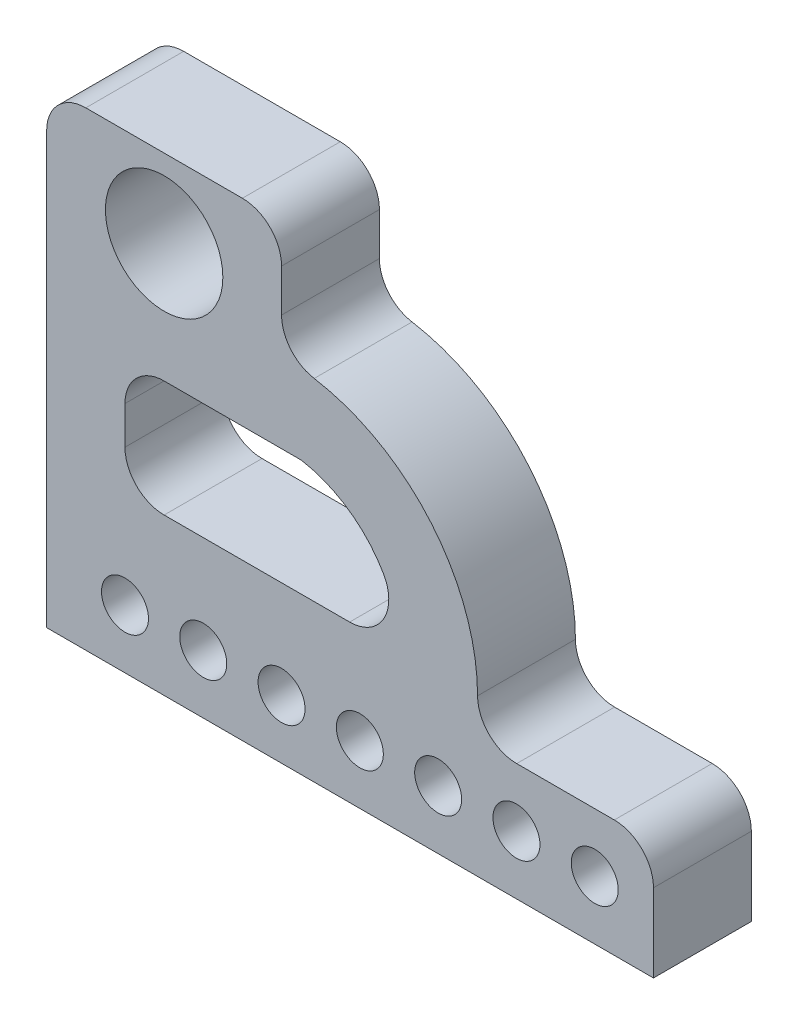
ISO-10303-21;
HEADER;
FILE_DESCRIPTION(('STEP AP214'),'2;1');
FILE_NAME('part.step','',(''),(''),'','','');
FILE_SCHEMA(('AUTOMOTIVE_DESIGN { 1 0 10303 214 1 1 1 1 }'));
ENDSEC;
DATA;
#1=APPLICATION_CONTEXT('core data for automotive mechanical design processes');
#2=APPLICATION_PROTOCOL_DEFINITION('international standard','automotive_design',2000,#1);
#3=PRODUCT_CONTEXT('',#1,'mechanical');
#4=PRODUCT('Part','Part','',(#3));
#5=PRODUCT_RELATED_PRODUCT_CATEGORY('part','',(#4));
#6=PRODUCT_DEFINITION_FORMATION('','',#4);
#7=PRODUCT_DEFINITION_CONTEXT('part definition',#1,'design');
#8=PRODUCT_DEFINITION('design','',#6,#7);
#9=PRODUCT_DEFINITION_SHAPE('','',#8);
#10=(LENGTH_UNIT() NAMED_UNIT(*) SI_UNIT(.MILLI.,.METRE.));
#11=(NAMED_UNIT(*) PLANE_ANGLE_UNIT() SI_UNIT($,.RADIAN.));
#12=(NAMED_UNIT(*) SI_UNIT($,.STERADIAN.) SOLID_ANGLE_UNIT());
#13=UNCERTAINTY_MEASURE_WITH_UNIT(LENGTH_MEASURE(1.E-05),#10,'distance_accuracy_value','');
#14=(GEOMETRIC_REPRESENTATION_CONTEXT(3) GLOBAL_UNCERTAINTY_ASSIGNED_CONTEXT((#13)) GLOBAL_UNIT_ASSIGNED_CONTEXT((#10,
#11,#12)) REPRESENTATION_CONTEXT('',''));
#15=CARTESIAN_POINT('',(0.,0.,0.));
#16=DIRECTION('',(0.,0.,1.));
#17=DIRECTION('',(1.,0.,0.));
#18=AXIS2_PLACEMENT_3D('',#15,#16,#17);
#19=CARTESIAN_POINT('',(64.9972203624435,-39.9551947285819,25.));
#20=DIRECTION('',(0.,0.,-1.));
#21=DIRECTION('',(-1.,0.,0.));
#22=AXIS2_PLACEMENT_3D('',#19,#20,#21);
#23=PLANE('',#22);
#24=CARTESIAN_POINT('',(-50.,40.0822492706513,25.));
#25=DIRECTION('',(0.,0.,1.));
#26=DIRECTION('',(1.,0.,0.));
#27=AXIS2_PLACEMENT_3D('',#24,#25,#26);
#28=CIRCLE('',#27,15.);
#29=CARTESIAN_POINT('',(-35.,40.0822492706513,25.));
#30=VERTEX_POINT('',#29);
#31=EDGE_CURVE('E225',#30,#30,#28,.T.);
#32=ORIENTED_EDGE('',*,*,#31,.F.);
#33=EDGE_LOOP('',(#32));
#34=FACE_BOUND('',#33,.T.);
#35=DIRECTION('',(1.,0.,0.));
#36=VECTOR('',#35,1.);
#37=CARTESIAN_POINT('',(-80.0027796375565,-59.9177507293487,25.));
#38=LINE('',#37,#36);
#39=CARTESIAN_POINT('',(-80.0027796375565,-59.9177507293487,25.));
#40=VERTEX_POINT('',#39);
#41=CARTESIAN_POINT('',(74.9972203624435,-59.9177507293487,25.));
#42=VERTEX_POINT('',#41);
#43=EDGE_CURVE('E231',#40,#42,#38,.T.);
#44=ORIENTED_EDGE('',*,*,#43,.T.);
#45=DIRECTION('',(0.,1.,0.));
#46=VECTOR('',#45,1.);
#47=CARTESIAN_POINT('',(74.9972203624435,-59.9177507293487,25.));
#48=LINE('',#47,#46);
#49=CARTESIAN_POINT('',(74.9972203624435,-39.9551947285819,25.));
#50=VERTEX_POINT('',#49);
#51=EDGE_CURVE('E234',#42,#50,#48,.T.);
#52=ORIENTED_EDGE('',*,*,#51,.T.);
#53=CARTESIAN_POINT('',(64.9972203624435,-39.9551947285819,25.));
#54=DIRECTION('',(0.,0.,1.));
#55=DIRECTION('',(-1.,0.,0.));
#56=AXIS2_PLACEMENT_3D('',#53,#54,#55);
#57=CIRCLE('',#56,10.);
#58=CARTESIAN_POINT('',(64.9995342558982,-29.9551949962871,25.));
#59=VERTEX_POINT('',#58);
#60=EDGE_CURVE('E237',#50,#59,#57,.T.);
#61=ORIENTED_EDGE('',*,*,#60,.T.);
#62=DIRECTION('',(-0.999999973229485,0.000231389345471848,0.));
#63=VECTOR('',#62,1.);
#64=CARTESIAN_POINT('',(40.0634272067355,-29.9494250466439,25.));
#65=LINE('',#64,#63);
#66=CARTESIAN_POINT('',(40.0634272067355,-29.9494250466439,25.));
#67=VERTEX_POINT('',#66);
#68=EDGE_CURVE('E239',#59,#67,#65,.T.);
#69=ORIENTED_EDGE('',*,*,#68,.T.);
#70=CARTESIAN_POINT('',(40.0657411001902,-19.949425314349,25.));
#71=DIRECTION('',(0.,0.,-1.));
#72=DIRECTION('',(1.,0.,0.));
#73=AXIS2_PLACEMENT_3D('',#70,#71,#72);
#74=CIRCLE('',#73,10.);
#75=CARTESIAN_POINT('',(30.0657444824087,-19.9576499333743,25.));
#76=VERTEX_POINT('',#75);
#77=EDGE_CURVE('E241',#67,#76,#74,.T.);
#78=ORIENTED_EDGE('',*,*,#77,.T.);
#79=CARTESIAN_POINT('',(-20.0164878493317,-19.9988406753921,25.));
#80=DIRECTION('',(0.,0.,1.));
#81=DIRECTION('',(1.,0.,0.));
#82=AXIS2_PLACEMENT_3D('',#79,#80,#81);
#83=CIRCLE('',#82,50.0822492706513);
#84=CARTESIAN_POINT('',(-11.6694463042231,29.3829230583172,25.));
#85=VERTEX_POINT('',#84);
#86=EDGE_CURVE('E243',#76,#85,#83,.T.);
#87=ORIENTED_EDGE('',*,*,#86,.T.);
#88=CARTESIAN_POINT('',(-10.0027796375565,39.2430560301499,25.));
#89=DIRECTION('',(0.,0.,-1.));
#90=DIRECTION('',(-1.,0.,0.));
#91=AXIS2_PLACEMENT_3D('',#88,#89,#90);
#92=CIRCLE('',#91,10.);
#93=CARTESIAN_POINT('',(-20.0027796375565,39.2430560301499,25.));
#94=VERTEX_POINT('',#93);
#95=EDGE_CURVE('E245',#85,#94,#92,.T.);
#96=ORIENTED_EDGE('',*,*,#95,.T.);
#97=DIRECTION('',(0.,1.,0.));
#98=VECTOR('',#97,1.);
#99=CARTESIAN_POINT('',(-20.0027796375565,50.0822492706512,25.));
#100=LINE('',#99,#98);
#101=CARTESIAN_POINT('',(-20.0027796375565,50.0822492706512,25.));
#102=VERTEX_POINT('',#101);
#103=EDGE_CURVE('E247',#94,#102,#100,.T.);
#104=ORIENTED_EDGE('',*,*,#103,.T.);
#105=CARTESIAN_POINT('',(-30.0027796375565,50.0822492706512,25.));
#106=DIRECTION('',(0.,0.,1.));
#107=DIRECTION('',(-1.,0.,0.));
#108=AXIS2_PLACEMENT_3D('',#105,#106,#107);
#109=CIRCLE('',#108,10.);
#110=CARTESIAN_POINT('',(-30.0027796375566,60.0822492706512,25.));
#111=VERTEX_POINT('',#110);
#112=EDGE_CURVE('E249',#102,#111,#109,.T.);
#113=ORIENTED_EDGE('',*,*,#112,.T.);
#114=DIRECTION('',(-1.,0.,0.));
#115=VECTOR('',#114,1.);
#116=CARTESIAN_POINT('',(-70.0027796375564,60.0822492706512,25.));
#117=LINE('',#116,#115);
#118=CARTESIAN_POINT('',(-70.0027796375564,60.0822492706512,25.));
#119=VERTEX_POINT('',#118);
#120=EDGE_CURVE('E251',#111,#119,#117,.T.);
#121=ORIENTED_EDGE('',*,*,#120,.T.);
#122=CARTESIAN_POINT('',(-70.0027796375565,50.0822492706512,25.));
#123=DIRECTION('',(0.,0.,1.));
#124=DIRECTION('',(-1.,0.,0.));
#125=AXIS2_PLACEMENT_3D('',#122,#123,#124);
#126=CIRCLE('',#125,10.);
#127=CARTESIAN_POINT('',(-80.0027796375565,50.0822492706512,25.));
#128=VERTEX_POINT('',#127);
#129=EDGE_CURVE('E253',#119,#128,#126,.T.);
#130=ORIENTED_EDGE('',*,*,#129,.T.);
#131=DIRECTION('',(0.,-1.,0.));
#132=VECTOR('',#131,1.);
#133=CARTESIAN_POINT('',(-80.0027796375565,-59.9177507293487,25.));
#134=LINE('',#133,#132);
#135=EDGE_CURVE('E255',#128,#40,#134,.T.);
#136=ORIENTED_EDGE('',*,*,#135,.T.);
#137=EDGE_LOOP('',(#44,#52,#61,#69,#78,#87,#96,#104,#113,#121,#130,#136));
#138=FACE_BOUND('',#137,.T.);
#139=CARTESIAN_POINT('',(-2.61260262640391,-9.97878504102906,25.));
#140=DIRECTION('',(0.,0.,1.));
#141=DIRECTION('',(-1.,0.,0.));
#142=AXIS2_PLACEMENT_3D('',#139,#140,#141);
#143=CIRCLE('',#142,10.);
#144=CARTESIAN_POINT('',(-2.60890612720822,-19.9787843578237,25.));
#145=VERTEX_POINT('',#144);
#146=CARTESIAN_POINT('',(6.05370013100796,-4.98927639619485,25.));
#147=VERTEX_POINT('',#146);
#148=EDGE_CURVE('E164',#145,#147,#143,.T.);
#149=ORIENTED_EDGE('',*,*,#148,.F.);
#150=DIRECTION('',(0.999999931679466,0.000369649919568534,0.));
#151=VECTOR('',#150,1.);
#152=CARTESIAN_POINT('',(-49.9990831383608,-19.9963021341411,25.));
#153=LINE('',#152,#151);
#154=CARTESIAN_POINT('',(-49.9990831383608,-19.9963021341411,25.));
#155=VERTEX_POINT('',#154);
#156=EDGE_CURVE('E197',#155,#145,#153,.T.);
#157=ORIENTED_EDGE('',*,*,#156,.F.);
#158=CARTESIAN_POINT('',(-50.0027796375565,-9.9963028173464,25.));
#159=DIRECTION('',(0.,0.,1.));
#160=DIRECTION('',(1.,0.,0.));
#161=AXIS2_PLACEMENT_3D('',#158,#159,#160);
#162=CIRCLE('',#161,10.);
#163=CARTESIAN_POINT('',(-60.0027796375565,-9.99630281734633,25.));
#164=VERTEX_POINT('',#163);
#165=EDGE_CURVE('E195',#164,#155,#162,.T.);
#166=ORIENTED_EDGE('',*,*,#165,.F.);
#167=DIRECTION('',(0.,-1.,0.));
#168=VECTOR('',#167,1.);
#169=CARTESIAN_POINT('',(-60.0027796375565,-0.337342885348287,25.));
#170=LINE('',#169,#168);
#171=CARTESIAN_POINT('',(-60.0027796375565,-0.337342885348287,25.));
#172=VERTEX_POINT('',#171);
#173=EDGE_CURVE('E193',#172,#164,#170,.T.);
#174=ORIENTED_EDGE('',*,*,#173,.F.);
#175=CARTESIAN_POINT('',(-50.0027796375565,-0.337342885348216,25.));
#176=DIRECTION('',(0.,0.,1.));
#177=DIRECTION('',(-1.,0.,0.));
#178=AXIS2_PLACEMENT_3D('',#175,#176,#177);
#179=CIRCLE('',#178,10.);
#180=CARTESIAN_POINT('',(-50.0027796375564,9.66265711465178,25.));
#181=VERTEX_POINT('',#180);
#182=EDGE_CURVE('E188',#181,#172,#179,.T.);
#183=ORIENTED_EDGE('',*,*,#182,.F.);
#184=DIRECTION('',(-1.,0.,0.));
#185=VECTOR('',#184,1.);
#186=CARTESIAN_POINT('',(-15.0027796375565,9.66265711465179,25.));
#187=LINE('',#186,#185);
#188=CARTESIAN_POINT('',(-15.0027796375565,9.66265711465179,25.));
#189=VERTEX_POINT('',#188);
#190=EDGE_CURVE('E186',#189,#181,#187,.T.);
#191=ORIENTED_EDGE('',*,*,#190,.F.);
#192=CARTESIAN_POINT('',(-20.0164878493317,-19.9988406753921,25.));
#193=DIRECTION('',(0.,0.,1.));
#194=DIRECTION('',(1.,0.,0.));
#195=AXIS2_PLACEMENT_3D('',#192,#193,#194);
#196=CIRCLE('',#195,30.0822492706513);
#197=EDGE_CURVE('E172',#147,#189,#196,.T.);
#198=ORIENTED_EDGE('',*,*,#197,.F.);
#199=EDGE_LOOP('',(#149,#157,#166,#174,#183,#191,#198));
#200=FACE_BOUND('',#199,.T.);
#201=CARTESIAN_POINT('',(-40.0027796375565,-44.9177507293487,25.));
#202=DIRECTION('',(0.,0.,1.));
#203=DIRECTION('',(1.,0.,0.));
#204=AXIS2_PLACEMENT_3D('',#201,#202,#203);
#205=CIRCLE('',#204,6.);
#206=CARTESIAN_POINT('',(-34.0027796375565,-44.9177507293487,25.));
#207=VERTEX_POINT('',#206);
#208=EDGE_CURVE('E200',#207,#207,#205,.T.);
#209=ORIENTED_EDGE('',*,*,#208,.F.);
#210=EDGE_LOOP('',(#209));
#211=FACE_BOUND('',#210,.T.);
#212=CARTESIAN_POINT('',(-60.0027796375565,-44.9177507293487,25.));
#213=DIRECTION('',(0.,0.,1.));
#214=DIRECTION('',(1.,0.,0.));
#215=AXIS2_PLACEMENT_3D('',#212,#213,#214);
#216=CIRCLE('',#215,6.);
#217=CARTESIAN_POINT('',(-54.0027796375565,-44.9177507293487,25.));
#218=VERTEX_POINT('',#217);
#219=EDGE_CURVE('E665',#218,#218,#216,.T.);
#220=ORIENTED_EDGE('',*,*,#219,.F.);
#221=EDGE_LOOP('',(#220));
#222=FACE_BOUND('',#221,.T.);
#223=CARTESIAN_POINT('',(-20.0027796375565,-44.9177507293487,25.));
#224=DIRECTION('',(0.,0.,1.));
#225=DIRECTION('',(1.,0.,0.));
#226=AXIS2_PLACEMENT_3D('',#223,#224,#225);
#227=CIRCLE('',#226,6.);
#228=CARTESIAN_POINT('',(-14.0027796375565,-44.9177507293487,25.));
#229=VERTEX_POINT('',#228);
#230=EDGE_CURVE('E659',#229,#229,#227,.T.);
#231=ORIENTED_EDGE('',*,*,#230,.F.);
#232=EDGE_LOOP('',(#231));
#233=FACE_BOUND('',#232,.T.);
#234=CARTESIAN_POINT('',(-0.00277963755651589,-44.9177507293487,25.));
#235=DIRECTION('',(0.,0.,1.));
#236=DIRECTION('',(1.,0.,0.));
#237=AXIS2_PLACEMENT_3D('',#234,#235,#236);
#238=CIRCLE('',#237,6.);
#239=CARTESIAN_POINT('',(5.99722036244349,-44.9177507293487,25.));
#240=VERTEX_POINT('',#239);
#241=EDGE_CURVE('E653',#240,#240,#238,.T.);
#242=ORIENTED_EDGE('',*,*,#241,.F.);
#243=EDGE_LOOP('',(#242));
#244=FACE_BOUND('',#243,.T.);
#245=CARTESIAN_POINT('',(19.9972203624435,-44.9177507293487,25.));
#246=DIRECTION('',(0.,0.,1.));
#247=DIRECTION('',(1.,0.,0.));
#248=AXIS2_PLACEMENT_3D('',#245,#246,#247);
#249=CIRCLE('',#248,6.);
#250=CARTESIAN_POINT('',(25.9972203624435,-44.9177507293487,25.));
#251=VERTEX_POINT('',#250);
#252=EDGE_CURVE('E647',#251,#251,#249,.T.);
#253=ORIENTED_EDGE('',*,*,#252,.F.);
#254=EDGE_LOOP('',(#253));
#255=FACE_BOUND('',#254,.T.);
#256=CARTESIAN_POINT('',(39.9972203624435,-44.9177507293487,25.));
#257=DIRECTION('',(0.,0.,1.));
#258=DIRECTION('',(1.,0.,0.));
#259=AXIS2_PLACEMENT_3D('',#256,#257,#258);
#260=CIRCLE('',#259,6.);
#261=CARTESIAN_POINT('',(45.9972203624435,-44.9177507293487,25.));
#262=VERTEX_POINT('',#261);
#263=EDGE_CURVE('E641',#262,#262,#260,.T.);
#264=ORIENTED_EDGE('',*,*,#263,.F.);
#265=EDGE_LOOP('',(#264));
#266=FACE_BOUND('',#265,.T.);
#267=CARTESIAN_POINT('',(59.9972203624435,-44.9177507293487,25.));
#268=DIRECTION('',(0.,0.,1.));
#269=DIRECTION('',(1.,0.,0.));
#270=AXIS2_PLACEMENT_3D('',#267,#268,#269);
#271=CIRCLE('',#270,6.);
#272=CARTESIAN_POINT('',(65.9972203624435,-44.9177507293487,25.));
#273=VERTEX_POINT('',#272);
#274=EDGE_CURVE('E632',#273,#273,#271,.T.);
#275=ORIENTED_EDGE('',*,*,#274,.F.);
#276=EDGE_LOOP('',(#275));
#277=FACE_BOUND('',#276,.T.);
#278=ADVANCED_FACE('F33',(#34,#138,#200,#211,#222,#233,#244,#255,#266,#277),#23,.F.);
#279=CARTESIAN_POINT('',(64.9972203624435,-39.9551947285819,0.));
#280=DIRECTION('',(0.,0.,-1.));
#281=DIRECTION('',(-1.,0.,0.));
#282=AXIS2_PLACEMENT_3D('',#279,#280,#281);
#283=PLANE('',#282);
#284=CARTESIAN_POINT('',(39.9972203624435,-44.9177507293487,0.));
#285=DIRECTION('',(0.,0.,1.));
#286=DIRECTION('',(1.,0.,0.));
#287=AXIS2_PLACEMENT_3D('',#284,#285,#286);
#288=CIRCLE('',#287,6.);
#289=CARTESIAN_POINT('',(45.9972203624435,-44.9177507293487,0.));
#290=VERTEX_POINT('',#289);
#291=EDGE_CURVE('E638',#290,#290,#288,.T.);
#292=ORIENTED_EDGE('',*,*,#291,.T.);
#293=EDGE_LOOP('',(#292));
#294=FACE_BOUND('',#293,.T.);
#295=CARTESIAN_POINT('',(-0.00277963755651589,-44.9177507293487,0.));
#296=DIRECTION('',(0.,0.,1.));
#297=DIRECTION('',(1.,0.,0.));
#298=AXIS2_PLACEMENT_3D('',#295,#296,#297);
#299=CIRCLE('',#298,6.);
#300=CARTESIAN_POINT('',(5.99722036244349,-44.9177507293487,0.));
#301=VERTEX_POINT('',#300);
#302=EDGE_CURVE('E650',#301,#301,#299,.T.);
#303=ORIENTED_EDGE('',*,*,#302,.T.);
#304=EDGE_LOOP('',(#303));
#305=FACE_BOUND('',#304,.T.);
#306=CARTESIAN_POINT('',(-60.0027796375565,-44.9177507293487,0.));
#307=DIRECTION('',(0.,0.,1.));
#308=DIRECTION('',(1.,0.,0.));
#309=AXIS2_PLACEMENT_3D('',#306,#307,#308);
#310=CIRCLE('',#309,6.);
#311=CARTESIAN_POINT('',(-54.0027796375565,-44.9177507293487,0.));
#312=VERTEX_POINT('',#311);
#313=EDGE_CURVE('E662',#312,#312,#310,.T.);
#314=ORIENTED_EDGE('',*,*,#313,.T.);
#315=EDGE_LOOP('',(#314));
#316=FACE_BOUND('',#315,.T.);
#317=DIRECTION('',(0.999999931679466,0.000369649919568534,0.));
#318=VECTOR('',#317,1.);
#319=CARTESIAN_POINT('',(-49.9990831383608,-19.9963021341411,0.));
#320=LINE('',#319,#318);
#321=CARTESIAN_POINT('',(-49.9990831383608,-19.9963021341411,0.));
#322=VERTEX_POINT('',#321);
#323=CARTESIAN_POINT('',(-2.60890612720822,-19.9787843578237,0.));
#324=VERTEX_POINT('',#323);
#325=EDGE_CURVE('E173',#322,#324,#320,.T.);
#326=ORIENTED_EDGE('',*,*,#325,.T.);
#327=CARTESIAN_POINT('',(-2.61260262640391,-9.97878504102906,0.));
#328=DIRECTION('',(0.,0.,1.));
#329=DIRECTION('',(-1.,0.,0.));
#330=AXIS2_PLACEMENT_3D('',#327,#328,#329);
#331=CIRCLE('',#330,10.);
#332=CARTESIAN_POINT('',(6.05370013100796,-4.98927639619485,0.));
#333=VERTEX_POINT('',#332);
#334=EDGE_CURVE('E56',#324,#333,#331,.T.);
#335=ORIENTED_EDGE('',*,*,#334,.T.);
#336=CARTESIAN_POINT('',(-20.0164878493317,-19.9988406753921,0.));
#337=DIRECTION('',(0.,0.,1.));
#338=DIRECTION('',(1.,0.,0.));
#339=AXIS2_PLACEMENT_3D('',#336,#337,#338);
#340=CIRCLE('',#339,30.0822492706513);
#341=CARTESIAN_POINT('',(-15.0027796375565,9.66265711465179,0.));
#342=VERTEX_POINT('',#341);
#343=EDGE_CURVE('E179',#333,#342,#340,.T.);
#344=ORIENTED_EDGE('',*,*,#343,.T.);
#345=DIRECTION('',(-1.,0.,0.));
#346=VECTOR('',#345,1.);
#347=CARTESIAN_POINT('',(-15.0027796375565,9.66265711465179,0.));
#348=LINE('',#347,#346);
#349=CARTESIAN_POINT('',(-50.0027796375564,9.66265711465178,0.));
#350=VERTEX_POINT('',#349);
#351=EDGE_CURVE('E202',#342,#350,#348,.T.);
#352=ORIENTED_EDGE('',*,*,#351,.T.);
#353=CARTESIAN_POINT('',(-50.0027796375565,-0.337342885348216,0.));
#354=DIRECTION('',(0.,0.,1.));
#355=DIRECTION('',(-1.,0.,0.));
#356=AXIS2_PLACEMENT_3D('',#353,#354,#355);
#357=CIRCLE('',#356,10.);
#358=CARTESIAN_POINT('',(-60.0027796375565,-0.337342885348287,0.));
#359=VERTEX_POINT('',#358);
#360=EDGE_CURVE('E205',#350,#359,#357,.T.);
#361=ORIENTED_EDGE('',*,*,#360,.T.);
#362=DIRECTION('',(0.,-1.,0.));
#363=VECTOR('',#362,1.);
#364=CARTESIAN_POINT('',(-60.0027796375565,-0.337342885348287,0.));
#365=LINE('',#364,#363);
#366=CARTESIAN_POINT('',(-60.0027796375565,-9.99630281734633,0.));
#367=VERTEX_POINT('',#366);
#368=EDGE_CURVE('E208',#359,#367,#365,.T.);
#369=ORIENTED_EDGE('',*,*,#368,.T.);
#370=CARTESIAN_POINT('',(-50.0027796375565,-9.9963028173464,0.));
#371=DIRECTION('',(0.,0.,1.));
#372=DIRECTION('',(1.,0.,0.));
#373=AXIS2_PLACEMENT_3D('',#370,#371,#372);
#374=CIRCLE('',#373,10.);
#375=EDGE_CURVE('E211',#367,#322,#374,.T.);
#376=ORIENTED_EDGE('',*,*,#375,.T.);
#377=EDGE_LOOP('',(#326,#335,#344,#352,#361,#369,#376));
#378=FACE_BOUND('',#377,.T.);
#379=CARTESIAN_POINT('',(-50.,40.0822492706513,0.));
#380=DIRECTION('',(0.,0.,1.));
#381=DIRECTION('',(1.,0.,0.));
#382=AXIS2_PLACEMENT_3D('',#379,#380,#381);
#383=CIRCLE('',#382,15.);
#384=CARTESIAN_POINT('',(-35.,40.0822492706513,0.));
#385=VERTEX_POINT('',#384);
#386=EDGE_CURVE('E180',#385,#385,#383,.T.);
#387=ORIENTED_EDGE('',*,*,#386,.T.);
#388=EDGE_LOOP('',(#387));
#389=FACE_BOUND('',#388,.T.);
#390=DIRECTION('',(1.,0.,0.));
#391=VECTOR('',#390,1.);
#392=CARTESIAN_POINT('',(-80.0027796375565,-59.9177507293487,0.));
#393=LINE('',#392,#391);
#394=CARTESIAN_POINT('',(-80.0027796375565,-59.9177507293487,0.));
#395=VERTEX_POINT('',#394);
#396=CARTESIAN_POINT('',(74.9972203624435,-59.9177507293487,0.));
#397=VERTEX_POINT('',#396);
#398=EDGE_CURVE('E228',#395,#397,#393,.T.);
#399=ORIENTED_EDGE('',*,*,#398,.F.);
#400=DIRECTION('',(0.,-1.,0.));
#401=VECTOR('',#400,1.);
#402=CARTESIAN_POINT('',(-80.0027796375565,-59.9177507293487,0.));
#403=LINE('',#402,#401);
#404=CARTESIAN_POINT('',(-80.0027796375565,50.0822492706512,0.));
#405=VERTEX_POINT('',#404);
#406=EDGE_CURVE('E235',#405,#395,#403,.T.);
#407=ORIENTED_EDGE('',*,*,#406,.F.);
#408=CARTESIAN_POINT('',(-70.0027796375565,50.0822492706512,0.));
#409=DIRECTION('',(0.,0.,1.));
#410=DIRECTION('',(-1.,0.,0.));
#411=AXIS2_PLACEMENT_3D('',#408,#409,#410);
#412=CIRCLE('',#411,10.);
#413=CARTESIAN_POINT('',(-70.0027796375564,60.0822492706512,0.));
#414=VERTEX_POINT('',#413);
#415=EDGE_CURVE('E278',#414,#405,#412,.T.);
#416=ORIENTED_EDGE('',*,*,#415,.F.);
#417=DIRECTION('',(-1.,0.,0.));
#418=VECTOR('',#417,1.);
#419=CARTESIAN_POINT('',(-70.0027796375564,60.0822492706512,0.));
#420=LINE('',#419,#418);
#421=CARTESIAN_POINT('',(-30.0027796375566,60.0822492706512,0.));
#422=VERTEX_POINT('',#421);
#423=EDGE_CURVE('E276',#422,#414,#420,.T.);
#424=ORIENTED_EDGE('',*,*,#423,.F.);
#425=CARTESIAN_POINT('',(-30.0027796375565,50.0822492706512,0.));
#426=DIRECTION('',(0.,0.,1.));
#427=DIRECTION('',(-1.,0.,0.));
#428=AXIS2_PLACEMENT_3D('',#425,#426,#427);
#429=CIRCLE('',#428,10.);
#430=CARTESIAN_POINT('',(-20.0027796375565,50.0822492706512,0.));
#431=VERTEX_POINT('',#430);
#432=EDGE_CURVE('E274',#431,#422,#429,.T.);
#433=ORIENTED_EDGE('',*,*,#432,.F.);
#434=DIRECTION('',(0.,1.,0.));
#435=VECTOR('',#434,1.);
#436=CARTESIAN_POINT('',(-20.0027796375565,50.0822492706512,0.));
#437=LINE('',#436,#435);
#438=CARTESIAN_POINT('',(-20.0027796375565,39.2430560301499,0.));
#439=VERTEX_POINT('',#438);
#440=EDGE_CURVE('E272',#439,#431,#437,.T.);
#441=ORIENTED_EDGE('',*,*,#440,.F.);
#442=CARTESIAN_POINT('',(-10.0027796375565,39.2430560301499,0.));
#443=DIRECTION('',(0.,0.,-1.));
#444=DIRECTION('',(-1.,0.,0.));
#445=AXIS2_PLACEMENT_3D('',#442,#443,#444);
#446=CIRCLE('',#445,10.);
#447=CARTESIAN_POINT('',(-11.6694463042231,29.3829230583172,0.));
#448=VERTEX_POINT('',#447);
#449=EDGE_CURVE('E270',#448,#439,#446,.T.);
#450=ORIENTED_EDGE('',*,*,#449,.F.);
#451=CARTESIAN_POINT('',(-20.0164878493317,-19.9988406753921,0.));
#452=DIRECTION('',(0.,0.,1.));
#453=DIRECTION('',(1.,0.,0.));
#454=AXIS2_PLACEMENT_3D('',#451,#452,#453);
#455=CIRCLE('',#454,50.0822492706513);
#456=CARTESIAN_POINT('',(30.0657444824087,-19.9576499333743,0.));
#457=VERTEX_POINT('',#456);
#458=EDGE_CURVE('E268',#457,#448,#455,.T.);
#459=ORIENTED_EDGE('',*,*,#458,.F.);
#460=CARTESIAN_POINT('',(40.0657411001902,-19.949425314349,0.));
#461=DIRECTION('',(0.,0.,-1.));
#462=DIRECTION('',(1.,0.,0.));
#463=AXIS2_PLACEMENT_3D('',#460,#461,#462);
#464=CIRCLE('',#463,10.);
#465=CARTESIAN_POINT('',(40.0634272067355,-29.9494250466439,0.));
#466=VERTEX_POINT('',#465);
#467=EDGE_CURVE('E266',#466,#457,#464,.T.);
#468=ORIENTED_EDGE('',*,*,#467,.F.);
#469=DIRECTION('',(-0.999999973229485,0.000231389345471848,0.));
#470=VECTOR('',#469,1.);
#471=CARTESIAN_POINT('',(40.0634272067355,-29.9494250466439,0.));
#472=LINE('',#471,#470);
#473=CARTESIAN_POINT('',(64.9995342558982,-29.9551949962871,0.));
#474=VERTEX_POINT('',#473);
#475=EDGE_CURVE('E264',#474,#466,#472,.T.);
#476=ORIENTED_EDGE('',*,*,#475,.F.);
#477=CARTESIAN_POINT('',(64.9972203624435,-39.9551947285819,0.));
#478=DIRECTION('',(0.,0.,1.));
#479=DIRECTION('',(-1.,0.,0.));
#480=AXIS2_PLACEMENT_3D('',#477,#478,#479);
#481=CIRCLE('',#480,10.);
#482=CARTESIAN_POINT('',(74.9972203624435,-39.9551947285819,0.));
#483=VERTEX_POINT('',#482);
#484=EDGE_CURVE('E262',#483,#474,#481,.T.);
#485=ORIENTED_EDGE('',*,*,#484,.F.);
#486=DIRECTION('',(0.,1.,0.));
#487=VECTOR('',#486,1.);
#488=CARTESIAN_POINT('',(74.9972203624435,-59.9177507293487,0.));
#489=LINE('',#488,#487);
#490=EDGE_CURVE('E260',#397,#483,#489,.T.);
#491=ORIENTED_EDGE('',*,*,#490,.F.);
#492=EDGE_LOOP('',(#399,#407,#416,#424,#433,#441,#450,#459,#468,#476,#485,#491));
#493=FACE_BOUND('',#492,.T.);
#494=CARTESIAN_POINT('',(-40.0027796375565,-44.9177507293487,0.));
#495=DIRECTION('',(0.,0.,1.));
#496=DIRECTION('',(1.,0.,0.));
#497=AXIS2_PLACEMENT_3D('',#494,#495,#496);
#498=CIRCLE('',#497,6.);
#499=CARTESIAN_POINT('',(-34.0027796375565,-44.9177507293487,0.));
#500=VERTEX_POINT('',#499);
#501=EDGE_CURVE('E668',#500,#500,#498,.T.);
#502=ORIENTED_EDGE('',*,*,#501,.T.);
#503=EDGE_LOOP('',(#502));
#504=FACE_BOUND('',#503,.T.);
#505=CARTESIAN_POINT('',(-20.0027796375565,-44.9177507293487,0.));
#506=DIRECTION('',(0.,0.,1.));
#507=DIRECTION('',(1.,0.,0.));
#508=AXIS2_PLACEMENT_3D('',#505,#506,#507);
#509=CIRCLE('',#508,6.);
#510=CARTESIAN_POINT('',(-14.0027796375565,-44.9177507293487,0.));
#511=VERTEX_POINT('',#510);
#512=EDGE_CURVE('E656',#511,#511,#509,.T.);
#513=ORIENTED_EDGE('',*,*,#512,.T.);
#514=EDGE_LOOP('',(#513));
#515=FACE_BOUND('',#514,.T.);
#516=CARTESIAN_POINT('',(19.9972203624435,-44.9177507293487,0.));
#517=DIRECTION('',(0.,0.,1.));
#518=DIRECTION('',(1.,0.,0.));
#519=AXIS2_PLACEMENT_3D('',#516,#517,#518);
#520=CIRCLE('',#519,6.);
#521=CARTESIAN_POINT('',(25.9972203624435,-44.9177507293487,0.));
#522=VERTEX_POINT('',#521);
#523=EDGE_CURVE('E644',#522,#522,#520,.T.);
#524=ORIENTED_EDGE('',*,*,#523,.T.);
#525=EDGE_LOOP('',(#524));
#526=FACE_BOUND('',#525,.T.);
#527=CARTESIAN_POINT('',(59.9972203624435,-44.9177507293487,0.));
#528=DIRECTION('',(0.,0.,1.));
#529=DIRECTION('',(1.,0.,0.));
#530=AXIS2_PLACEMENT_3D('',#527,#528,#529);
#531=CIRCLE('',#530,6.);
#532=CARTESIAN_POINT('',(65.9972203624435,-44.9177507293487,0.));
#533=VERTEX_POINT('',#532);
#534=EDGE_CURVE('E635',#533,#533,#531,.T.);
#535=ORIENTED_EDGE('',*,*,#534,.T.);
#536=EDGE_LOOP('',(#535));
#537=FACE_BOUND('',#536,.T.);
#538=ADVANCED_FACE('F320',(#294,#305,#316,#378,#389,#493,#504,#515,#526,#537),#283,.T.);
#539=CARTESIAN_POINT('',(-80.0027796375565,-59.9177507293487,25.));
#540=DIRECTION('',(0.,1.,0.));
#541=DIRECTION('',(0.,0.,1.));
#542=AXIS2_PLACEMENT_3D('',#539,#540,#541);
#543=PLANE('',#542);
#544=ORIENTED_EDGE('',*,*,#398,.T.);
#545=DIRECTION('',(0.,0.,-1.));
#546=VECTOR('',#545,1.);
#547=CARTESIAN_POINT('',(74.9972203624435,-59.9177507293487,25.));
#548=LINE('',#547,#546);
#549=EDGE_CURVE('E11',#42,#397,#548,.T.);
#550=ORIENTED_EDGE('',*,*,#549,.F.);
#551=ORIENTED_EDGE('',*,*,#43,.F.);
#552=DIRECTION('',(0.,0.,-1.));
#553=VECTOR('',#552,1.);
#554=CARTESIAN_POINT('',(-80.0027796375565,-59.9177507293487,25.));
#555=LINE('',#554,#553);
#556=EDGE_CURVE('E257',#40,#395,#555,.T.);
#557=ORIENTED_EDGE('',*,*,#556,.T.);
#558=EDGE_LOOP('',(#544,#550,#551,#557));
#559=FACE_BOUND('',#558,.T.);
#560=ADVANCED_FACE('F35',(#559),#543,.F.);
#561=CARTESIAN_POINT('',(74.9972203624435,-59.9177507293487,25.));
#562=DIRECTION('',(-1.,0.,0.));
#563=DIRECTION('',(0.,-1.,0.));
#564=AXIS2_PLACEMENT_3D('',#561,#562,#563);
#565=PLANE('',#564);
#566=ORIENTED_EDGE('',*,*,#490,.T.);
#567=DIRECTION('',(0.,0.,-1.));
#568=VECTOR('',#567,1.);
#569=CARTESIAN_POINT('',(74.9972203624435,-39.9551947285819,25.));
#570=LINE('',#569,#568);
#571=EDGE_CURVE('E41',#50,#483,#570,.T.);
#572=ORIENTED_EDGE('',*,*,#571,.F.);
#573=ORIENTED_EDGE('',*,*,#51,.F.);
#574=ORIENTED_EDGE('',*,*,#549,.T.);
#575=EDGE_LOOP('',(#566,#572,#573,#574));
#576=FACE_BOUND('',#575,.T.);
#577=ADVANCED_FACE('F337',(#576),#565,.F.);
#578=CARTESIAN_POINT('',(64.9972203624435,-39.9551947285819,25.));
#579=DIRECTION('',(0.,0.,-1.));
#580=DIRECTION('',(-1.,0.,0.));
#581=AXIS2_PLACEMENT_3D('',#578,#579,#580);
#582=CYLINDRICAL_SURFACE('',#581,10.);
#583=ORIENTED_EDGE('',*,*,#484,.T.);
#584=DIRECTION('',(0.,0.,-1.));
#585=VECTOR('',#584,1.);
#586=CARTESIAN_POINT('',(64.9995342558982,-29.9551949962871,25.));
#587=LINE('',#586,#585);
#588=EDGE_CURVE('E307',#59,#474,#587,.T.);
#589=ORIENTED_EDGE('',*,*,#588,.F.);
#590=ORIENTED_EDGE('',*,*,#60,.F.);
#591=ORIENTED_EDGE('',*,*,#571,.T.);
#592=EDGE_LOOP('',(#583,#589,#590,#591));
#593=FACE_BOUND('',#592,.T.);
#594=ADVANCED_FACE('F314',(#593),#582,.T.);
#595=CARTESIAN_POINT('',(40.0634272067355,-29.9494250466439,25.));
#596=DIRECTION('',(-0.000231389345471848,-0.999999973229485,0.));
#597=DIRECTION('',(0.999999973229485,-0.000231389345471848,0.));
#598=AXIS2_PLACEMENT_3D('',#595,#596,#597);
#599=PLANE('',#598);
#600=ORIENTED_EDGE('',*,*,#475,.T.);
#601=DIRECTION('',(0.,0.,-1.));
#602=VECTOR('',#601,1.);
#603=CARTESIAN_POINT('',(40.0634272067355,-29.9494250466439,25.));
#604=LINE('',#603,#602);
#605=EDGE_CURVE('E304',#67,#466,#604,.T.);
#606=ORIENTED_EDGE('',*,*,#605,.F.);
#607=ORIENTED_EDGE('',*,*,#68,.F.);
#608=ORIENTED_EDGE('',*,*,#588,.T.);
#609=EDGE_LOOP('',(#600,#606,#607,#608));
#610=FACE_BOUND('',#609,.T.);
#611=ADVANCED_FACE('F326',(#610),#599,.F.);
#612=CARTESIAN_POINT('',(40.0657411001902,-19.949425314349,25.));
#613=DIRECTION('',(0.,0.,-1.));
#614=DIRECTION('',(-1.,0.,0.));
#615=AXIS2_PLACEMENT_3D('',#612,#613,#614);
#616=CYLINDRICAL_SURFACE('',#615,10.);
#617=ORIENTED_EDGE('',*,*,#467,.T.);
#618=DIRECTION('',(0.,0.,-1.));
#619=VECTOR('',#618,1.);
#620=CARTESIAN_POINT('',(30.0657444824087,-19.9576499333743,25.));
#621=LINE('',#620,#619);
#622=EDGE_CURVE('E301',#76,#457,#621,.T.);
#623=ORIENTED_EDGE('',*,*,#622,.F.);
#624=ORIENTED_EDGE('',*,*,#77,.F.);
#625=ORIENTED_EDGE('',*,*,#605,.T.);
#626=EDGE_LOOP('',(#617,#623,#624,#625));
#627=FACE_BOUND('',#626,.T.);
#628=ADVANCED_FACE('F330',(#627),#616,.F.);
#629=CARTESIAN_POINT('',(-20.0164878493317,-19.9988406753921,25.));
#630=DIRECTION('',(0.,0.,-1.));
#631=DIRECTION('',(-1.,0.,0.));
#632=AXIS2_PLACEMENT_3D('',#629,#630,#631);
#633=CYLINDRICAL_SURFACE('',#632,50.0822492706513);
#634=ORIENTED_EDGE('',*,*,#458,.T.);
#635=DIRECTION('',(0.,0.,-1.));
#636=VECTOR('',#635,1.);
#637=CARTESIAN_POINT('',(-11.6694463042231,29.3829230583172,25.));
#638=LINE('',#637,#636);
#639=EDGE_CURVE('E298',#85,#448,#638,.T.);
#640=ORIENTED_EDGE('',*,*,#639,.F.);
#641=ORIENTED_EDGE('',*,*,#86,.F.);
#642=ORIENTED_EDGE('',*,*,#622,.T.);
#643=EDGE_LOOP('',(#634,#640,#641,#642));
#644=FACE_BOUND('',#643,.T.);
#645=ADVANCED_FACE('F370',(#644),#633,.T.);
#646=CARTESIAN_POINT('',(-10.0027796375565,39.2430560301499,25.));
#647=DIRECTION('',(0.,0.,-1.));
#648=DIRECTION('',(-1.,0.,0.));
#649=AXIS2_PLACEMENT_3D('',#646,#647,#648);
#650=CYLINDRICAL_SURFACE('',#649,10.);
#651=ORIENTED_EDGE('',*,*,#449,.T.);
#652=DIRECTION('',(0.,0.,-1.));
#653=VECTOR('',#652,1.);
#654=CARTESIAN_POINT('',(-20.0027796375565,39.2430560301499,25.));
#655=LINE('',#654,#653);
#656=EDGE_CURVE('E295',#94,#439,#655,.T.);
#657=ORIENTED_EDGE('',*,*,#656,.F.);
#658=ORIENTED_EDGE('',*,*,#95,.F.);
#659=ORIENTED_EDGE('',*,*,#639,.T.);
#660=EDGE_LOOP('',(#651,#657,#658,#659));
#661=FACE_BOUND('',#660,.T.);
#662=ADVANCED_FACE('F368',(#661),#650,.F.);
#663=CARTESIAN_POINT('',(-20.0027796375565,50.0822492706512,25.));
#664=DIRECTION('',(-1.,0.,0.));
#665=DIRECTION('',(0.,0.,1.));
#666=AXIS2_PLACEMENT_3D('',#663,#664,#665);
#667=PLANE('',#666);
#668=ORIENTED_EDGE('',*,*,#440,.T.);
#669=DIRECTION('',(0.,0.,-1.));
#670=VECTOR('',#669,1.);
#671=CARTESIAN_POINT('',(-20.0027796375565,50.0822492706512,25.));
#672=LINE('',#671,#670);
#673=EDGE_CURVE('E292',#102,#431,#672,.T.);
#674=ORIENTED_EDGE('',*,*,#673,.F.);
#675=ORIENTED_EDGE('',*,*,#103,.F.);
#676=ORIENTED_EDGE('',*,*,#656,.T.);
#677=EDGE_LOOP('',(#668,#674,#675,#676));
#678=FACE_BOUND('',#677,.T.);
#679=ADVANCED_FACE('F364',(#678),#667,.F.);
#680=CARTESIAN_POINT('',(-30.0027796375565,50.0822492706512,25.));
#681=DIRECTION('',(0.,0.,-1.));
#682=DIRECTION('',(-1.,0.,0.));
#683=AXIS2_PLACEMENT_3D('',#680,#681,#682);
#684=CYLINDRICAL_SURFACE('',#683,10.);
#685=ORIENTED_EDGE('',*,*,#432,.T.);
#686=DIRECTION('',(0.,0.,-1.));
#687=VECTOR('',#686,1.);
#688=CARTESIAN_POINT('',(-30.0027796375566,60.0822492706512,25.));
#689=LINE('',#688,#687);
#690=EDGE_CURVE('E289',#111,#422,#689,.T.);
#691=ORIENTED_EDGE('',*,*,#690,.F.);
#692=ORIENTED_EDGE('',*,*,#112,.F.);
#693=ORIENTED_EDGE('',*,*,#673,.T.);
#694=EDGE_LOOP('',(#685,#691,#692,#693));
#695=FACE_BOUND('',#694,.T.);
#696=ADVANCED_FACE('F359',(#695),#684,.T.);
#697=CARTESIAN_POINT('',(-70.0027796375564,60.0822492706512,25.));
#698=DIRECTION('',(0.,-1.,0.));
#699=DIRECTION('',(0.,0.,-1.));
#700=AXIS2_PLACEMENT_3D('',#697,#698,#699);
#701=PLANE('',#700);
#702=ORIENTED_EDGE('',*,*,#423,.T.);
#703=DIRECTION('',(0.,0.,-1.));
#704=VECTOR('',#703,1.);
#705=CARTESIAN_POINT('',(-70.0027796375564,60.0822492706512,25.));
#706=LINE('',#705,#704);
#707=EDGE_CURVE('E286',#119,#414,#706,.T.);
#708=ORIENTED_EDGE('',*,*,#707,.F.);
#709=ORIENTED_EDGE('',*,*,#120,.F.);
#710=ORIENTED_EDGE('',*,*,#690,.T.);
#711=EDGE_LOOP('',(#702,#708,#709,#710));
#712=FACE_BOUND('',#711,.T.);
#713=ADVANCED_FACE('F353',(#712),#701,.F.);
#714=CARTESIAN_POINT('',(-70.0027796375565,50.0822492706512,25.));
#715=DIRECTION('',(0.,0.,-1.));
#716=DIRECTION('',(-1.,0.,0.));
#717=AXIS2_PLACEMENT_3D('',#714,#715,#716);
#718=CYLINDRICAL_SURFACE('',#717,10.);
#719=ORIENTED_EDGE('',*,*,#415,.T.);
#720=DIRECTION('',(0.,0.,-1.));
#721=VECTOR('',#720,1.);
#722=CARTESIAN_POINT('',(-80.0027796375565,50.0822492706512,25.));
#723=LINE('',#722,#721);
#724=EDGE_CURVE('E283',#128,#405,#723,.T.);
#725=ORIENTED_EDGE('',*,*,#724,.F.);
#726=ORIENTED_EDGE('',*,*,#129,.F.);
#727=ORIENTED_EDGE('',*,*,#707,.T.);
#728=EDGE_LOOP('',(#719,#725,#726,#727));
#729=FACE_BOUND('',#728,.T.);
#730=ADVANCED_FACE('F349',(#729),#718,.T.);
#731=CARTESIAN_POINT('',(-80.0027796375565,-59.9177507293487,25.));
#732=DIRECTION('',(1.,0.,0.));
#733=DIRECTION('',(0.,0.,-1.));
#734=AXIS2_PLACEMENT_3D('',#731,#732,#733);
#735=PLANE('',#734);
#736=ORIENTED_EDGE('',*,*,#406,.T.);
#737=ORIENTED_EDGE('',*,*,#556,.F.);
#738=ORIENTED_EDGE('',*,*,#135,.F.);
#739=ORIENTED_EDGE('',*,*,#724,.T.);
#740=EDGE_LOOP('',(#736,#737,#738,#739));
#741=FACE_BOUND('',#740,.T.);
#742=ADVANCED_FACE('F344',(#741),#735,.F.);
#743=CARTESIAN_POINT('',(-50.,40.0822492706513,25.));
#744=DIRECTION('',(0.,0.,-1.));
#745=DIRECTION('',(-1.,0.,0.));
#746=AXIS2_PLACEMENT_3D('',#743,#744,#745);
#747=CYLINDRICAL_SURFACE('',#746,15.);
#748=ORIENTED_EDGE('',*,*,#31,.T.);
#749=EDGE_LOOP('',(#748));
#750=FACE_BOUND('',#749,.T.);
#751=ORIENTED_EDGE('',*,*,#386,.F.);
#752=EDGE_LOOP('',(#751));
#753=FACE_BOUND('',#752,.T.);
#754=ADVANCED_FACE('F389',(#750,#753),#747,.F.);
#755=CARTESIAN_POINT('',(-2.61260262640391,-9.97878504102906,25.));
#756=DIRECTION('',(0.,0.,-1.));
#757=DIRECTION('',(-1.,0.,0.));
#758=AXIS2_PLACEMENT_3D('',#755,#756,#757);
#759=CYLINDRICAL_SURFACE('',#758,10.);
#760=ORIENTED_EDGE('',*,*,#334,.F.);
#761=DIRECTION('',(0.,0.,-1.));
#762=VECTOR('',#761,1.);
#763=CARTESIAN_POINT('',(-2.60890612720822,-19.9787843578237,25.));
#764=LINE('',#763,#762);
#765=EDGE_CURVE('E168',#145,#324,#764,.T.);
#766=ORIENTED_EDGE('',*,*,#765,.F.);
#767=ORIENTED_EDGE('',*,*,#148,.T.);
#768=DIRECTION('',(0.,0.,-1.));
#769=VECTOR('',#768,1.);
#770=CARTESIAN_POINT('',(6.05370013100796,-4.98927639619485,25.));
#771=LINE('',#770,#769);
#772=EDGE_CURVE('E167',#147,#333,#771,.T.);
#773=ORIENTED_EDGE('',*,*,#772,.T.);
#774=EDGE_LOOP('',(#760,#766,#767,#773));
#775=FACE_BOUND('',#774,.T.);
#776=ADVANCED_FACE('F166',(#775),#759,.F.);
#777=CARTESIAN_POINT('',(-20.0164878493317,-19.9988406753921,25.));
#778=DIRECTION('',(0.,0.,-1.));
#779=DIRECTION('',(-1.,0.,0.));
#780=AXIS2_PLACEMENT_3D('',#777,#778,#779);
#781=CYLINDRICAL_SURFACE('',#780,30.0822492706513);
#782=ORIENTED_EDGE('',*,*,#343,.F.);
#783=ORIENTED_EDGE('',*,*,#772,.F.);
#784=ORIENTED_EDGE('',*,*,#197,.T.);
#785=DIRECTION('',(0.,0.,-1.));
#786=VECTOR('',#785,1.);
#787=CARTESIAN_POINT('',(-15.0027796375565,9.66265711465179,25.));
#788=LINE('',#787,#786);
#789=EDGE_CURVE('E181',#189,#342,#788,.T.);
#790=ORIENTED_EDGE('',*,*,#789,.T.);
#791=EDGE_LOOP('',(#782,#783,#784,#790));
#792=FACE_BOUND('',#791,.T.);
#793=ADVANCED_FACE('F176',(#792),#781,.F.);
#794=CARTESIAN_POINT('',(-15.0027796375565,9.66265711465179,25.));
#795=DIRECTION('',(0.,-1.,0.));
#796=DIRECTION('',(1.,0.,0.));
#797=AXIS2_PLACEMENT_3D('',#794,#795,#796);
#798=PLANE('',#797);
#799=ORIENTED_EDGE('',*,*,#351,.F.);
#800=ORIENTED_EDGE('',*,*,#789,.F.);
#801=ORIENTED_EDGE('',*,*,#190,.T.);
#802=DIRECTION('',(0.,0.,-1.));
#803=VECTOR('',#802,1.);
#804=CARTESIAN_POINT('',(-50.0027796375564,9.66265711465178,25.));
#805=LINE('',#804,#803);
#806=EDGE_CURVE('E222',#181,#350,#805,.T.);
#807=ORIENTED_EDGE('',*,*,#806,.T.);
#808=EDGE_LOOP('',(#799,#800,#801,#807));
#809=FACE_BOUND('',#808,.T.);
#810=ADVANCED_FACE('F438',(#809),#798,.T.);
#811=CARTESIAN_POINT('',(-50.0027796375565,-0.337342885348216,25.));
#812=DIRECTION('',(0.,0.,-1.));
#813=DIRECTION('',(-1.,0.,0.));
#814=AXIS2_PLACEMENT_3D('',#811,#812,#813);
#815=CYLINDRICAL_SURFACE('',#814,10.);
#816=ORIENTED_EDGE('',*,*,#360,.F.);
#817=ORIENTED_EDGE('',*,*,#806,.F.);
#818=ORIENTED_EDGE('',*,*,#182,.T.);
#819=DIRECTION('',(0.,0.,-1.));
#820=VECTOR('',#819,1.);
#821=CARTESIAN_POINT('',(-60.0027796375565,-0.337342885348287,25.));
#822=LINE('',#821,#820);
#823=EDGE_CURVE('E220',#172,#359,#822,.T.);
#824=ORIENTED_EDGE('',*,*,#823,.T.);
#825=EDGE_LOOP('',(#816,#817,#818,#824));
#826=FACE_BOUND('',#825,.T.);
#827=ADVANCED_FACE('F445',(#826),#815,.F.);
#828=CARTESIAN_POINT('',(-60.0027796375565,-0.337342885348287,25.));
#829=DIRECTION('',(1.,0.,0.));
#830=DIRECTION('',(0.,0.,-1.));
#831=AXIS2_PLACEMENT_3D('',#828,#829,#830);
#832=PLANE('',#831);
#833=ORIENTED_EDGE('',*,*,#368,.F.);
#834=ORIENTED_EDGE('',*,*,#823,.F.);
#835=ORIENTED_EDGE('',*,*,#173,.T.);
#836=DIRECTION('',(0.,0.,-1.));
#837=VECTOR('',#836,1.);
#838=CARTESIAN_POINT('',(-60.0027796375565,-9.99630281734633,25.));
#839=LINE('',#838,#837);
#840=EDGE_CURVE('E218',#164,#367,#839,.T.);
#841=ORIENTED_EDGE('',*,*,#840,.T.);
#842=EDGE_LOOP('',(#833,#834,#835,#841));
#843=FACE_BOUND('',#842,.T.);
#844=ADVANCED_FACE('F453',(#843),#832,.T.);
#845=CARTESIAN_POINT('',(-50.0027796375565,-9.9963028173464,25.));
#846=DIRECTION('',(0.,0.,-1.));
#847=DIRECTION('',(-1.,0.,0.));
#848=AXIS2_PLACEMENT_3D('',#845,#846,#847);
#849=CYLINDRICAL_SURFACE('',#848,10.);
#850=ORIENTED_EDGE('',*,*,#375,.F.);
#851=ORIENTED_EDGE('',*,*,#840,.F.);
#852=ORIENTED_EDGE('',*,*,#165,.T.);
#853=DIRECTION('',(0.,0.,-1.));
#854=VECTOR('',#853,1.);
#855=CARTESIAN_POINT('',(-49.9990831383608,-19.9963021341411,25.));
#856=LINE('',#855,#854);
#857=EDGE_CURVE('E48',#155,#322,#856,.T.);
#858=ORIENTED_EDGE('',*,*,#857,.T.);
#859=EDGE_LOOP('',(#850,#851,#852,#858));
#860=FACE_BOUND('',#859,.T.);
#861=ADVANCED_FACE('F461',(#860),#849,.F.);
#862=CARTESIAN_POINT('',(-49.9990831383608,-19.9963021341411,25.));
#863=DIRECTION('',(-0.000369649919568534,0.999999931679466,0.));
#864=DIRECTION('',(-0.999999931679466,-0.000369649919568534,0.));
#865=AXIS2_PLACEMENT_3D('',#862,#863,#864);
#866=PLANE('',#865);
#867=ORIENTED_EDGE('',*,*,#325,.F.);
#868=ORIENTED_EDGE('',*,*,#857,.F.);
#869=ORIENTED_EDGE('',*,*,#156,.T.);
#870=ORIENTED_EDGE('',*,*,#765,.T.);
#871=EDGE_LOOP('',(#867,#868,#869,#870));
#872=FACE_BOUND('',#871,.T.);
#873=ADVANCED_FACE('F469',(#872),#866,.T.);
#874=CARTESIAN_POINT('',(-40.0027796375565,-44.9177507293487,25.));
#875=DIRECTION('',(0.,0.,-1.));
#876=DIRECTION('',(-1.,0.,0.));
#877=AXIS2_PLACEMENT_3D('',#874,#875,#876);
#878=CYLINDRICAL_SURFACE('',#877,6.);
#879=ORIENTED_EDGE('',*,*,#208,.T.);
#880=EDGE_LOOP('',(#879));
#881=FACE_BOUND('',#880,.T.);
#882=ORIENTED_EDGE('',*,*,#501,.F.);
#883=EDGE_LOOP('',(#882));
#884=FACE_BOUND('',#883,.T.);
#885=ADVANCED_FACE('F477',(#881,#884),#878,.F.);
#886=CARTESIAN_POINT('',(-60.0027796375565,-44.9177507293487,25.));
#887=DIRECTION('',(0.,0.,-1.));
#888=DIRECTION('',(-1.,0.,0.));
#889=AXIS2_PLACEMENT_3D('',#886,#887,#888);
#890=CYLINDRICAL_SURFACE('',#889,6.);
#891=ORIENTED_EDGE('',*,*,#219,.T.);
#892=EDGE_LOOP('',(#891));
#893=FACE_BOUND('',#892,.T.);
#894=ORIENTED_EDGE('',*,*,#313,.F.);
#895=EDGE_LOOP('',(#894));
#896=FACE_BOUND('',#895,.T.);
#897=ADVANCED_FACE('F484',(#893,#896),#890,.F.);
#898=CARTESIAN_POINT('',(-20.0027796375565,-44.9177507293487,25.));
#899=DIRECTION('',(0.,0.,-1.));
#900=DIRECTION('',(-1.,0.,0.));
#901=AXIS2_PLACEMENT_3D('',#898,#899,#900);
#902=CYLINDRICAL_SURFACE('',#901,6.);
#903=ORIENTED_EDGE('',*,*,#230,.T.);
#904=EDGE_LOOP('',(#903));
#905=FACE_BOUND('',#904,.T.);
#906=ORIENTED_EDGE('',*,*,#512,.F.);
#907=EDGE_LOOP('',(#906));
#908=FACE_BOUND('',#907,.T.);
#909=ADVANCED_FACE('F492',(#905,#908),#902,.F.);
#910=CARTESIAN_POINT('',(-0.00277963755651589,-44.9177507293487,25.));
#911=DIRECTION('',(0.,0.,-1.));
#912=DIRECTION('',(-1.,0.,0.));
#913=AXIS2_PLACEMENT_3D('',#910,#911,#912);
#914=CYLINDRICAL_SURFACE('',#913,6.);
#915=ORIENTED_EDGE('',*,*,#241,.T.);
#916=EDGE_LOOP('',(#915));
#917=FACE_BOUND('',#916,.T.);
#918=ORIENTED_EDGE('',*,*,#302,.F.);
#919=EDGE_LOOP('',(#918));
#920=FACE_BOUND('',#919,.T.);
#921=ADVANCED_FACE('F500',(#917,#920),#914,.F.);
#922=CARTESIAN_POINT('',(19.9972203624435,-44.9177507293487,25.));
#923=DIRECTION('',(0.,0.,-1.));
#924=DIRECTION('',(-1.,0.,0.));
#925=AXIS2_PLACEMENT_3D('',#922,#923,#924);
#926=CYLINDRICAL_SURFACE('',#925,6.);
#927=ORIENTED_EDGE('',*,*,#252,.T.);
#928=EDGE_LOOP('',(#927));
#929=FACE_BOUND('',#928,.T.);
#930=ORIENTED_EDGE('',*,*,#523,.F.);
#931=EDGE_LOOP('',(#930));
#932=FACE_BOUND('',#931,.T.);
#933=ADVANCED_FACE('F508',(#929,#932),#926,.F.);
#934=CARTESIAN_POINT('',(39.9972203624435,-44.9177507293487,25.));
#935=DIRECTION('',(0.,0.,-1.));
#936=DIRECTION('',(-1.,0.,0.));
#937=AXIS2_PLACEMENT_3D('',#934,#935,#936);
#938=CYLINDRICAL_SURFACE('',#937,6.);
#939=ORIENTED_EDGE('',*,*,#263,.T.);
#940=EDGE_LOOP('',(#939));
#941=FACE_BOUND('',#940,.T.);
#942=ORIENTED_EDGE('',*,*,#291,.F.);
#943=EDGE_LOOP('',(#942));
#944=FACE_BOUND('',#943,.T.);
#945=ADVANCED_FACE('F516',(#941,#944),#938,.F.);
#946=CARTESIAN_POINT('',(59.9972203624435,-44.9177507293487,25.));
#947=DIRECTION('',(0.,0.,-1.));
#948=DIRECTION('',(-1.,0.,0.));
#949=AXIS2_PLACEMENT_3D('',#946,#947,#948);
#950=CYLINDRICAL_SURFACE('',#949,6.);
#951=ORIENTED_EDGE('',*,*,#274,.T.);
#952=EDGE_LOOP('',(#951));
#953=FACE_BOUND('',#952,.T.);
#954=ORIENTED_EDGE('',*,*,#534,.F.);
#955=EDGE_LOOP('',(#954));
#956=FACE_BOUND('',#955,.T.);
#957=ADVANCED_FACE('F524',(#953,#956),#950,.F.);
#958=CLOSED_SHELL('',(#278,#538,#560,#577,#594,#611,#628,#645,#662,#679,#696,#713,#730,#742,
#754,#776,#793,#810,#827,#844,#861,#873,#885,#897,#909,#921,#933,#945,#957));
#959=MANIFOLD_SOLID_BREP('B2',#958);
#960=ADVANCED_BREP_SHAPE_REPRESENTATION('',(#18,#959),#14);
#961=SHAPE_DEFINITION_REPRESENTATION(#9,#960);
ENDSEC;
END-ISO-10303-21;
